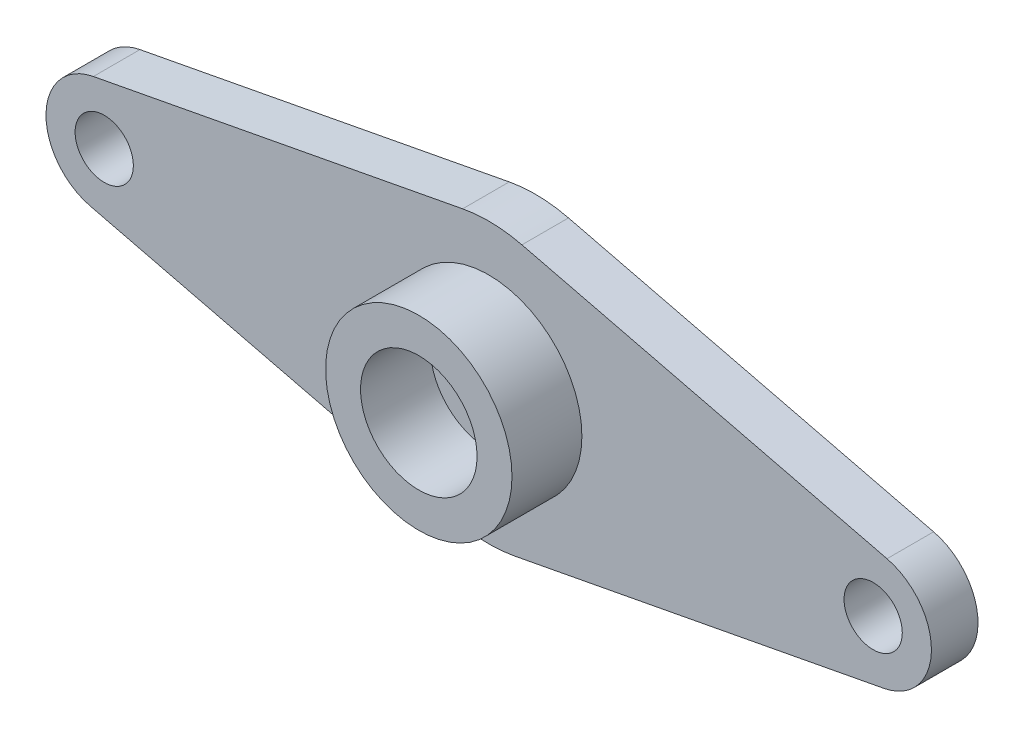
ISO-10303-21;
HEADER;
FILE_DESCRIPTION(('STEP AP214'),'2;1');
FILE_NAME('part.step','',(''),(''),'','','');
FILE_SCHEMA(('AUTOMOTIVE_DESIGN { 1 0 10303 214 1 1 1 1 }'));
ENDSEC;
DATA;
#1=APPLICATION_CONTEXT('core data for automotive mechanical design processes');
#2=APPLICATION_PROTOCOL_DEFINITION('international standard','automotive_design',2000,#1);
#3=PRODUCT_CONTEXT('',#1,'mechanical');
#4=PRODUCT('Part','Part','',(#3));
#5=PRODUCT_RELATED_PRODUCT_CATEGORY('part','',(#4));
#6=PRODUCT_DEFINITION_FORMATION('','',#4);
#7=PRODUCT_DEFINITION_CONTEXT('part definition',#1,'design');
#8=PRODUCT_DEFINITION('design','',#6,#7);
#9=PRODUCT_DEFINITION_SHAPE('','',#8);
#10=(LENGTH_UNIT() NAMED_UNIT(*) SI_UNIT(.MILLI.,.METRE.));
#11=(NAMED_UNIT(*) PLANE_ANGLE_UNIT() SI_UNIT($,.RADIAN.));
#12=(NAMED_UNIT(*) SI_UNIT($,.STERADIAN.) SOLID_ANGLE_UNIT());
#13=UNCERTAINTY_MEASURE_WITH_UNIT(LENGTH_MEASURE(1.E-05),#10,'distance_accuracy_value','');
#14=(GEOMETRIC_REPRESENTATION_CONTEXT(3) GLOBAL_UNCERTAINTY_ASSIGNED_CONTEXT((#13)) GLOBAL_UNIT_ASSIGNED_CONTEXT((#10,
#11,#12)) REPRESENTATION_CONTEXT('',''));
#15=CARTESIAN_POINT('',(0.,0.,0.));
#16=DIRECTION('',(0.,0.,1.));
#17=DIRECTION('',(1.,0.,0.));
#18=AXIS2_PLACEMENT_3D('',#15,#16,#17);
#19=CARTESIAN_POINT('',(-16.5,0.432588472456704,2.));
#20=DIRECTION('',(0.,0.,1.));
#21=DIRECTION('',(1.,0.,0.));
#22=AXIS2_PLACEMENT_3D('',#19,#20,#21);
#23=PLANE('',#22);
#24=CARTESIAN_POINT('',(0.,0.,2.));
#25=DIRECTION('',(0.,0.,1.));
#26=DIRECTION('',(1.,0.,0.));
#27=AXIS2_PLACEMENT_3D('',#24,#25,#26);
#28=CIRCLE('',#27,1.25);
#29=CARTESIAN_POINT('',(1.25,0.,2.));
#30=VERTEX_POINT('',#29);
#31=EDGE_CURVE('E228',#30,#30,#28,.T.);
#32=ORIENTED_EDGE('',*,*,#31,.F.);
#33=EDGE_LOOP('',(#32));
#34=FACE_BOUND('',#33,.T.);
#35=CARTESIAN_POINT('',(0.,0.,2.));
#36=DIRECTION('',(0.,0.,1.));
#37=DIRECTION('',(1.,0.,0.));
#38=AXIS2_PLACEMENT_3D('',#35,#36,#37);
#39=CIRCLE('',#38,2.5);
#40=CARTESIAN_POINT('',(2.5,0.,2.));
#41=VERTEX_POINT('',#40);
#42=EDGE_CURVE('E11',#41,#41,#39,.F.);
#43=ORIENTED_EDGE('',*,*,#42,.F.);
#44=EDGE_LOOP('',(#43));
#45=FACE_BOUND('',#44,.T.);
#46=ADVANCED_FACE('F39',(#34,#45),#23,.T.);
#47=CARTESIAN_POINT('',(0.,0.,2.));
#48=DIRECTION('',(0.,0.,1.));
#49=DIRECTION('',(1.,0.,0.));
#50=AXIS2_PLACEMENT_3D('',#47,#48,#49);
#51=CIRCLE('',#50,4.);
#52=CARTESIAN_POINT('',(4.,0.,2.));
#53=VERTEX_POINT('',#52);
#54=EDGE_CURVE('E240',#53,#53,#51,.T.);
#55=ORIENTED_EDGE('',*,*,#54,.F.);
#56=EDGE_LOOP('',(#55));
#57=FACE_BOUND('',#56,.T.);
#58=CARTESIAN_POINT('',(16.5,-0.432588472456706,2.));
#59=DIRECTION('',(0.,0.,1.));
#60=DIRECTION('',(1.,0.,0.));
#61=AXIS2_PLACEMENT_3D('',#58,#59,#60);
#62=CIRCLE('',#61,1.25);
#63=CARTESIAN_POINT('',(17.75,-0.432588472456706,2.));
#64=VERTEX_POINT('',#63);
#65=EDGE_CURVE('E220',#64,#64,#62,.T.);
#66=ORIENTED_EDGE('',*,*,#65,.F.);
#67=EDGE_LOOP('',(#66));
#68=FACE_BOUND('',#67,.T.);
#69=CARTESIAN_POINT('',(-16.5,0.432588472456704,2.));
#70=DIRECTION('',(0.,0.,1.));
#71=DIRECTION('',(1.,0.,0.));
#72=AXIS2_PLACEMENT_3D('',#69,#70,#71);
#73=CIRCLE('',#72,2.5);
#74=CARTESIAN_POINT('',(-16.9659075857741,2.88879085042115,2.));
#75=VERTEX_POINT('',#74);
#76=CARTESIAN_POINT('',(-17.0939699611912,-1.99582658374817,2.));
#77=VERTEX_POINT('',#76);
#78=EDGE_CURVE('E166',#75,#77,#73,.T.);
#79=ORIENTED_EDGE('',*,*,#78,.T.);
#80=DIRECTION('',(0.971366022481951,-0.237587984476473,0.));
#81=VECTOR('',#80,1.);
#82=CARTESIAN_POINT('',(-1.42552790685884,-5.82819613489171,2.));
#83=LINE('',#82,#81);
#84=CARTESIAN_POINT('',(-1.42552790685884,-5.82819613489171,2.));
#85=VERTEX_POINT('',#84);
#86=EDGE_CURVE('E101',#77,#85,#83,.T.);
#87=ORIENTED_EDGE('',*,*,#86,.T.);
#88=CARTESIAN_POINT('',(0.,0.,2.));
#89=DIRECTION('',(0.,0.,1.));
#90=DIRECTION('',(1.,0.,0.));
#91=AXIS2_PLACEMENT_3D('',#88,#89,#90);
#92=CIRCLE('',#91,6.);
#93=CARTESIAN_POINT('',(1.11817820585772,-5.89488570711467,2.));
#94=VERTEX_POINT('',#93);
#95=EDGE_CURVE('E206',#85,#94,#92,.T.);
#96=ORIENTED_EDGE('',*,*,#95,.T.);
#97=DIRECTION('',(0.982480951185778,0.18636303430962,0.));
#98=VECTOR('',#97,1.);
#99=CARTESIAN_POINT('',(16.9659075857741,-2.88879085042115,2.));
#100=LINE('',#99,#98);
#101=CARTESIAN_POINT('',(16.9659075857741,-2.88879085042115,2.));
#102=VERTEX_POINT('',#101);
#103=EDGE_CURVE('E204',#94,#102,#100,.T.);
#104=ORIENTED_EDGE('',*,*,#103,.T.);
#105=CARTESIAN_POINT('',(16.5,-0.432588472456706,2.));
#106=DIRECTION('',(0.,0.,1.));
#107=DIRECTION('',(1.,0.,0.));
#108=AXIS2_PLACEMENT_3D('',#105,#106,#107);
#109=CIRCLE('',#108,2.5);
#110=CARTESIAN_POINT('',(17.0939699611912,1.99582658374817,2.));
#111=VERTEX_POINT('',#110);
#112=EDGE_CURVE('E121',#102,#111,#109,.T.);
#113=ORIENTED_EDGE('',*,*,#112,.T.);
#114=DIRECTION('',(-0.971366022481951,0.237587984476474,0.));
#115=VECTOR('',#114,1.);
#116=CARTESIAN_POINT('',(1.42552790685884,5.82819613489171,2.));
#117=LINE('',#116,#115);
#118=CARTESIAN_POINT('',(1.42552790685884,5.82819613489171,2.));
#119=VERTEX_POINT('',#118);
#120=EDGE_CURVE('E114',#111,#119,#117,.T.);
#121=ORIENTED_EDGE('',*,*,#120,.T.);
#122=CARTESIAN_POINT('',(0.,0.,2.));
#123=DIRECTION('',(0.,0.,1.));
#124=DIRECTION('',(1.,0.,0.));
#125=AXIS2_PLACEMENT_3D('',#122,#123,#124);
#126=CIRCLE('',#125,6.);
#127=CARTESIAN_POINT('',(-1.11817820585772,5.89488570711467,2.));
#128=VERTEX_POINT('',#127);
#129=EDGE_CURVE('E119',#119,#128,#126,.T.);
#130=ORIENTED_EDGE('',*,*,#129,.T.);
#131=DIRECTION('',(-0.982480951185778,-0.18636303430962,0.));
#132=VECTOR('',#131,1.);
#133=CARTESIAN_POINT('',(-16.9659075857741,2.88879085042115,2.));
#134=LINE('',#133,#132);
#135=EDGE_CURVE('E57',#128,#75,#134,.T.);
#136=ORIENTED_EDGE('',*,*,#135,.T.);
#137=EDGE_LOOP('',(#79,#87,#96,#104,#113,#121,#130,#136));
#138=FACE_BOUND('',#137,.T.);
#139=CARTESIAN_POINT('',(-16.5,0.432588472456704,2.));
#140=DIRECTION('',(0.,0.,1.));
#141=DIRECTION('',(1.,0.,0.));
#142=AXIS2_PLACEMENT_3D('',#139,#140,#141);
#143=CIRCLE('',#142,1.25);
#144=CARTESIAN_POINT('',(-15.25,0.432588472456704,2.));
#145=VERTEX_POINT('',#144);
#146=EDGE_CURVE('E148',#145,#145,#143,.T.);
#147=ORIENTED_EDGE('',*,*,#146,.F.);
#148=EDGE_LOOP('',(#147));
#149=FACE_BOUND('',#148,.T.);
#150=ADVANCED_FACE('F116',(#57,#68,#138,#149),#23,.T.);
#151=CARTESIAN_POINT('',(-16.5,0.432588472456704,0.));
#152=DIRECTION('',(0.,0.,1.));
#153=DIRECTION('',(1.,0.,0.));
#154=AXIS2_PLACEMENT_3D('',#151,#152,#153);
#155=PLANE('',#154);
#156=CARTESIAN_POINT('',(-16.5,0.432588472456704,0.));
#157=DIRECTION('',(0.,0.,1.));
#158=DIRECTION('',(1.,0.,0.));
#159=AXIS2_PLACEMENT_3D('',#156,#157,#158);
#160=CIRCLE('',#159,2.5);
#161=CARTESIAN_POINT('',(-16.9659075857741,2.88879085042115,0.));
#162=VERTEX_POINT('',#161);
#163=CARTESIAN_POINT('',(-17.0939699611912,-1.99582658374817,0.));
#164=VERTEX_POINT('',#163);
#165=EDGE_CURVE('E143',#162,#164,#160,.T.);
#166=ORIENTED_EDGE('',*,*,#165,.F.);
#167=DIRECTION('',(-0.982480951185778,-0.18636303430962,0.));
#168=VECTOR('',#167,1.);
#169=CARTESIAN_POINT('',(-16.9659075857741,2.88879085042115,0.));
#170=LINE('',#169,#168);
#171=CARTESIAN_POINT('',(-1.11817820585772,5.89488570711467,0.));
#172=VERTEX_POINT('',#171);
#173=EDGE_CURVE('E92',#172,#162,#170,.T.);
#174=ORIENTED_EDGE('',*,*,#173,.F.);
#175=CARTESIAN_POINT('',(0.,0.,0.));
#176=DIRECTION('',(0.,0.,1.));
#177=DIRECTION('',(1.,0.,0.));
#178=AXIS2_PLACEMENT_3D('',#175,#176,#177);
#179=CIRCLE('',#178,6.);
#180=CARTESIAN_POINT('',(1.42552790685884,5.82819613489171,0.));
#181=VERTEX_POINT('',#180);
#182=EDGE_CURVE('E86',#181,#172,#179,.T.);
#183=ORIENTED_EDGE('',*,*,#182,.F.);
#184=DIRECTION('',(-0.971366022481951,0.237587984476474,0.));
#185=VECTOR('',#184,1.);
#186=CARTESIAN_POINT('',(1.42552790685884,5.82819613489171,0.));
#187=LINE('',#186,#185);
#188=CARTESIAN_POINT('',(17.0939699611912,1.99582658374817,0.));
#189=VERTEX_POINT('',#188);
#190=EDGE_CURVE('E130',#189,#181,#187,.T.);
#191=ORIENTED_EDGE('',*,*,#190,.F.);
#192=CARTESIAN_POINT('',(16.5,-0.432588472456706,0.));
#193=DIRECTION('',(0.,0.,1.));
#194=DIRECTION('',(1.,0.,0.));
#195=AXIS2_PLACEMENT_3D('',#192,#193,#194);
#196=CIRCLE('',#195,2.5);
#197=CARTESIAN_POINT('',(16.9659075857741,-2.88879085042115,0.));
#198=VERTEX_POINT('',#197);
#199=EDGE_CURVE('E157',#198,#189,#196,.T.);
#200=ORIENTED_EDGE('',*,*,#199,.F.);
#201=DIRECTION('',(0.982480951185778,0.18636303430962,0.));
#202=VECTOR('',#201,1.);
#203=CARTESIAN_POINT('',(16.9659075857741,-2.88879085042115,0.));
#204=LINE('',#203,#202);
#205=CARTESIAN_POINT('',(1.11817820585772,-5.89488570711467,0.));
#206=VERTEX_POINT('',#205);
#207=EDGE_CURVE('E154',#206,#198,#204,.T.);
#208=ORIENTED_EDGE('',*,*,#207,.F.);
#209=CARTESIAN_POINT('',(0.,0.,0.));
#210=DIRECTION('',(0.,0.,1.));
#211=DIRECTION('',(1.,0.,0.));
#212=AXIS2_PLACEMENT_3D('',#209,#210,#211);
#213=CIRCLE('',#212,6.);
#214=CARTESIAN_POINT('',(-1.42552790685884,-5.82819613489171,0.));
#215=VERTEX_POINT('',#214);
#216=EDGE_CURVE('E151',#215,#206,#213,.T.);
#217=ORIENTED_EDGE('',*,*,#216,.F.);
#218=DIRECTION('',(0.971366022481951,-0.237587984476473,0.));
#219=VECTOR('',#218,1.);
#220=CARTESIAN_POINT('',(-1.42552790685884,-5.82819613489171,0.));
#221=LINE('',#220,#219);
#222=EDGE_CURVE('E147',#164,#215,#221,.T.);
#223=ORIENTED_EDGE('',*,*,#222,.F.);
#224=EDGE_LOOP('',(#166,#174,#183,#191,#200,#208,#217,#223));
#225=FACE_BOUND('',#224,.T.);
#226=CARTESIAN_POINT('',(-16.5,0.432588472456704,0.));
#227=DIRECTION('',(0.,0.,1.));
#228=DIRECTION('',(1.,0.,0.));
#229=AXIS2_PLACEMENT_3D('',#226,#227,#228);
#230=CIRCLE('',#229,1.25);
#231=CARTESIAN_POINT('',(-15.25,0.432588472456704,0.));
#232=VERTEX_POINT('',#231);
#233=EDGE_CURVE('E216',#232,#232,#230,.T.);
#234=ORIENTED_EDGE('',*,*,#233,.T.);
#235=EDGE_LOOP('',(#234));
#236=FACE_BOUND('',#235,.T.);
#237=CARTESIAN_POINT('',(16.5,-0.432588472456706,0.));
#238=DIRECTION('',(0.,0.,1.));
#239=DIRECTION('',(1.,0.,0.));
#240=AXIS2_PLACEMENT_3D('',#237,#238,#239);
#241=CIRCLE('',#240,1.25);
#242=CARTESIAN_POINT('',(17.75,-0.432588472456706,0.));
#243=VERTEX_POINT('',#242);
#244=EDGE_CURVE('E224',#243,#243,#241,.T.);
#245=ORIENTED_EDGE('',*,*,#244,.T.);
#246=EDGE_LOOP('',(#245));
#247=FACE_BOUND('',#246,.T.);
#248=CARTESIAN_POINT('',(0.,0.,0.));
#249=DIRECTION('',(0.,0.,1.));
#250=DIRECTION('',(1.,0.,0.));
#251=AXIS2_PLACEMENT_3D('',#248,#249,#250);
#252=CIRCLE('',#251,1.25);
#253=CARTESIAN_POINT('',(1.25,0.,0.));
#254=VERTEX_POINT('',#253);
#255=EDGE_CURVE('E232',#254,#254,#252,.T.);
#256=ORIENTED_EDGE('',*,*,#255,.T.);
#257=EDGE_LOOP('',(#256));
#258=FACE_BOUND('',#257,.T.);
#259=ADVANCED_FACE('F191',(#225,#236,#247,#258),#155,.F.);
#260=CARTESIAN_POINT('',(-16.5,0.432588472456704,2.));
#261=DIRECTION('',(0.,0.,-1.));
#262=DIRECTION('',(-1.,0.,0.));
#263=AXIS2_PLACEMENT_3D('',#260,#261,#262);
#264=CYLINDRICAL_SURFACE('',#263,2.5);
#265=ORIENTED_EDGE('',*,*,#165,.T.);
#266=DIRECTION('',(0.,0.,-1.));
#267=VECTOR('',#266,1.);
#268=CARTESIAN_POINT('',(-17.0939699611912,-1.99582658374817,2.));
#269=LINE('',#268,#267);
#270=EDGE_CURVE('E49',#77,#164,#269,.T.);
#271=ORIENTED_EDGE('',*,*,#270,.F.);
#272=ORIENTED_EDGE('',*,*,#78,.F.);
#273=DIRECTION('',(0.,0.,-1.));
#274=VECTOR('',#273,1.);
#275=CARTESIAN_POINT('',(-16.9659075857741,2.88879085042115,2.));
#276=LINE('',#275,#274);
#277=EDGE_CURVE('E139',#75,#162,#276,.T.);
#278=ORIENTED_EDGE('',*,*,#277,.T.);
#279=EDGE_LOOP('',(#265,#271,#272,#278));
#280=FACE_BOUND('',#279,.T.);
#281=ADVANCED_FACE('F41',(#280),#264,.T.);
#282=CARTESIAN_POINT('',(-1.42552790685884,-5.82819613489171,2.));
#283=DIRECTION('',(0.237587984476473,0.971366022481951,0.));
#284=DIRECTION('',(-0.971366022481951,0.237587984476473,0.));
#285=AXIS2_PLACEMENT_3D('',#282,#283,#284);
#286=PLANE('',#285);
#287=ORIENTED_EDGE('',*,*,#222,.T.);
#288=DIRECTION('',(0.,0.,-1.));
#289=VECTOR('',#288,1.);
#290=CARTESIAN_POINT('',(-1.42552790685884,-5.82819613489171,2.));
#291=LINE('',#290,#289);
#292=EDGE_CURVE('E181',#85,#215,#291,.T.);
#293=ORIENTED_EDGE('',*,*,#292,.F.);
#294=ORIENTED_EDGE('',*,*,#86,.F.);
#295=ORIENTED_EDGE('',*,*,#270,.T.);
#296=EDGE_LOOP('',(#287,#293,#294,#295));
#297=FACE_BOUND('',#296,.T.);
#298=ADVANCED_FACE('F186',(#297),#286,.F.);
#299=CARTESIAN_POINT('',(0.,0.,2.));
#300=DIRECTION('',(0.,0.,-1.));
#301=DIRECTION('',(-1.,0.,0.));
#302=AXIS2_PLACEMENT_3D('',#299,#300,#301);
#303=CYLINDRICAL_SURFACE('',#302,6.);
#304=ORIENTED_EDGE('',*,*,#216,.T.);
#305=DIRECTION('',(0.,0.,-1.));
#306=VECTOR('',#305,1.);
#307=CARTESIAN_POINT('',(1.11817820585772,-5.89488570711467,2.));
#308=LINE('',#307,#306);
#309=EDGE_CURVE('E177',#94,#206,#308,.T.);
#310=ORIENTED_EDGE('',*,*,#309,.F.);
#311=ORIENTED_EDGE('',*,*,#95,.F.);
#312=ORIENTED_EDGE('',*,*,#292,.T.);
#313=EDGE_LOOP('',(#304,#310,#311,#312));
#314=FACE_BOUND('',#313,.T.);
#315=ADVANCED_FACE('F198',(#314),#303,.T.);
#316=CARTESIAN_POINT('',(16.9659075857741,-2.88879085042115,2.));
#317=DIRECTION('',(-0.18636303430962,0.982480951185778,0.));
#318=DIRECTION('',(-0.982480951185778,-0.18636303430962,0.));
#319=AXIS2_PLACEMENT_3D('',#316,#317,#318);
#320=PLANE('',#319);
#321=ORIENTED_EDGE('',*,*,#207,.T.);
#322=DIRECTION('',(0.,0.,-1.));
#323=VECTOR('',#322,1.);
#324=CARTESIAN_POINT('',(16.9659075857741,-2.88879085042115,2.));
#325=LINE('',#324,#323);
#326=EDGE_CURVE('E173',#102,#198,#325,.T.);
#327=ORIENTED_EDGE('',*,*,#326,.F.);
#328=ORIENTED_EDGE('',*,*,#103,.F.);
#329=ORIENTED_EDGE('',*,*,#309,.T.);
#330=EDGE_LOOP('',(#321,#327,#328,#329));
#331=FACE_BOUND('',#330,.T.);
#332=ADVANCED_FACE('F202',(#331),#320,.F.);
#333=CARTESIAN_POINT('',(16.5,-0.432588472456706,2.));
#334=DIRECTION('',(0.,0.,-1.));
#335=DIRECTION('',(-1.,0.,0.));
#336=AXIS2_PLACEMENT_3D('',#333,#334,#335);
#337=CYLINDRICAL_SURFACE('',#336,2.5);
#338=ORIENTED_EDGE('',*,*,#199,.T.);
#339=DIRECTION('',(0.,0.,-1.));
#340=VECTOR('',#339,1.);
#341=CARTESIAN_POINT('',(17.0939699611912,1.99582658374817,2.));
#342=LINE('',#341,#340);
#343=EDGE_CURVE('E132',#111,#189,#342,.T.);
#344=ORIENTED_EDGE('',*,*,#343,.F.);
#345=ORIENTED_EDGE('',*,*,#112,.F.);
#346=ORIENTED_EDGE('',*,*,#326,.T.);
#347=EDGE_LOOP('',(#338,#344,#345,#346));
#348=FACE_BOUND('',#347,.T.);
#349=ADVANCED_FACE('F293',(#348),#337,.T.);
#350=CARTESIAN_POINT('',(1.42552790685884,5.82819613489171,2.));
#351=DIRECTION('',(-0.237587984476474,-0.971366022481951,0.));
#352=DIRECTION('',(0.971366022481951,-0.237587984476474,0.));
#353=AXIS2_PLACEMENT_3D('',#350,#351,#352);
#354=PLANE('',#353);
#355=ORIENTED_EDGE('',*,*,#190,.T.);
#356=DIRECTION('',(0.,0.,-1.));
#357=VECTOR('',#356,1.);
#358=CARTESIAN_POINT('',(1.42552790685884,5.82819613489171,2.));
#359=LINE('',#358,#357);
#360=EDGE_CURVE('E127',#119,#181,#359,.T.);
#361=ORIENTED_EDGE('',*,*,#360,.F.);
#362=ORIENTED_EDGE('',*,*,#120,.F.);
#363=ORIENTED_EDGE('',*,*,#343,.T.);
#364=EDGE_LOOP('',(#355,#361,#362,#363));
#365=FACE_BOUND('',#364,.T.);
#366=ADVANCED_FACE('F128',(#365),#354,.F.);
#367=CARTESIAN_POINT('',(0.,0.,2.));
#368=DIRECTION('',(0.,0.,-1.));
#369=DIRECTION('',(-1.,0.,0.));
#370=AXIS2_PLACEMENT_3D('',#367,#368,#369);
#371=CYLINDRICAL_SURFACE('',#370,6.);
#372=ORIENTED_EDGE('',*,*,#182,.T.);
#373=DIRECTION('',(0.,0.,-1.));
#374=VECTOR('',#373,1.);
#375=CARTESIAN_POINT('',(-1.11817820585772,5.89488570711467,2.));
#376=LINE('',#375,#374);
#377=EDGE_CURVE('E133',#128,#172,#376,.T.);
#378=ORIENTED_EDGE('',*,*,#377,.F.);
#379=ORIENTED_EDGE('',*,*,#129,.F.);
#380=ORIENTED_EDGE('',*,*,#360,.T.);
#381=EDGE_LOOP('',(#372,#378,#379,#380));
#382=FACE_BOUND('',#381,.T.);
#383=ADVANCED_FACE('F135',(#382),#371,.T.);
#384=CARTESIAN_POINT('',(-16.9659075857741,2.88879085042115,2.));
#385=DIRECTION('',(0.18636303430962,-0.982480951185778,0.));
#386=DIRECTION('',(0.982480951185778,0.18636303430962,0.));
#387=AXIS2_PLACEMENT_3D('',#384,#385,#386);
#388=PLANE('',#387);
#389=ORIENTED_EDGE('',*,*,#173,.T.);
#390=ORIENTED_EDGE('',*,*,#277,.F.);
#391=ORIENTED_EDGE('',*,*,#135,.F.);
#392=ORIENTED_EDGE('',*,*,#377,.T.);
#393=EDGE_LOOP('',(#389,#390,#391,#392));
#394=FACE_BOUND('',#393,.T.);
#395=ADVANCED_FACE('F286',(#394),#388,.F.);
#396=CARTESIAN_POINT('',(-16.5,0.432588472456704,2.));
#397=DIRECTION('',(0.,0.,-1.));
#398=DIRECTION('',(-1.,0.,0.));
#399=AXIS2_PLACEMENT_3D('',#396,#397,#398);
#400=CYLINDRICAL_SURFACE('',#399,1.25);
#401=ORIENTED_EDGE('',*,*,#146,.T.);
#402=EDGE_LOOP('',(#401));
#403=FACE_BOUND('',#402,.T.);
#404=ORIENTED_EDGE('',*,*,#233,.F.);
#405=EDGE_LOOP('',(#404));
#406=FACE_BOUND('',#405,.T.);
#407=ADVANCED_FACE('F282',(#403,#406),#400,.F.);
#408=CARTESIAN_POINT('',(16.5,-0.432588472456706,2.));
#409=DIRECTION('',(0.,0.,-1.));
#410=DIRECTION('',(-1.,0.,0.));
#411=AXIS2_PLACEMENT_3D('',#408,#409,#410);
#412=CYLINDRICAL_SURFACE('',#411,1.25);
#413=ORIENTED_EDGE('',*,*,#65,.T.);
#414=EDGE_LOOP('',(#413));
#415=FACE_BOUND('',#414,.T.);
#416=ORIENTED_EDGE('',*,*,#244,.F.);
#417=EDGE_LOOP('',(#416));
#418=FACE_BOUND('',#417,.T.);
#419=ADVANCED_FACE('F267',(#415,#418),#412,.F.);
#420=CARTESIAN_POINT('',(0.,0.,2.));
#421=DIRECTION('',(0.,0.,-1.));
#422=DIRECTION('',(-1.,0.,0.));
#423=AXIS2_PLACEMENT_3D('',#420,#421,#422);
#424=CYLINDRICAL_SURFACE('',#423,1.25);
#425=ORIENTED_EDGE('',*,*,#31,.T.);
#426=EDGE_LOOP('',(#425));
#427=FACE_BOUND('',#426,.T.);
#428=ORIENTED_EDGE('',*,*,#255,.F.);
#429=EDGE_LOOP('',(#428));
#430=FACE_BOUND('',#429,.T.);
#431=ADVANCED_FACE('F258',(#427,#430),#424,.F.);
#432=CARTESIAN_POINT('',(0.,0.,5.));
#433=DIRECTION('',(0.,0.,1.));
#434=DIRECTION('',(1.,0.,0.));
#435=AXIS2_PLACEMENT_3D('',#432,#433,#434);
#436=PLANE('',#435);
#437=CARTESIAN_POINT('',(0.,0.,5.));
#438=DIRECTION('',(0.,0.,1.));
#439=DIRECTION('',(1.,0.,0.));
#440=AXIS2_PLACEMENT_3D('',#437,#438,#439);
#441=CIRCLE('',#440,4.);
#442=CARTESIAN_POINT('',(4.,0.,5.));
#443=VERTEX_POINT('',#442);
#444=EDGE_CURVE('E236',#443,#443,#441,.T.);
#445=ORIENTED_EDGE('',*,*,#444,.T.);
#446=EDGE_LOOP('',(#445));
#447=FACE_BOUND('',#446,.T.);
#448=CARTESIAN_POINT('',(0.,0.,5.));
#449=DIRECTION('',(0.,0.,1.));
#450=DIRECTION('',(1.,0.,0.));
#451=AXIS2_PLACEMENT_3D('',#448,#449,#450);
#452=CIRCLE('',#451,2.5);
#453=CARTESIAN_POINT('',(2.5,0.,5.));
#454=VERTEX_POINT('',#453);
#455=EDGE_CURVE('E244',#454,#454,#452,.T.);
#456=ORIENTED_EDGE('',*,*,#455,.F.);
#457=EDGE_LOOP('',(#456));
#458=FACE_BOUND('',#457,.T.);
#459=ADVANCED_FACE('F255',(#447,#458),#436,.T.);
#460=CARTESIAN_POINT('',(0.,0.,5.));
#461=DIRECTION('',(0.,0.,-1.));
#462=DIRECTION('',(-1.,0.,0.));
#463=AXIS2_PLACEMENT_3D('',#460,#461,#462);
#464=CYLINDRICAL_SURFACE('',#463,4.);
#465=ORIENTED_EDGE('',*,*,#444,.F.);
#466=EDGE_LOOP('',(#465));
#467=FACE_BOUND('',#466,.T.);
#468=ORIENTED_EDGE('',*,*,#54,.T.);
#469=EDGE_LOOP('',(#468));
#470=FACE_BOUND('',#469,.T.);
#471=ADVANCED_FACE('F257',(#467,#470),#464,.T.);
#472=CARTESIAN_POINT('',(0.,0.,5.));
#473=DIRECTION('',(0.,0.,-1.));
#474=DIRECTION('',(-1.,0.,0.));
#475=AXIS2_PLACEMENT_3D('',#472,#473,#474);
#476=CYLINDRICAL_SURFACE('',#475,2.5);
#477=ORIENTED_EDGE('',*,*,#455,.T.);
#478=EDGE_LOOP('',(#477));
#479=FACE_BOUND('',#478,.T.);
#480=ORIENTED_EDGE('',*,*,#42,.T.);
#481=EDGE_LOOP('',(#480));
#482=FACE_BOUND('',#481,.T.);
#483=ADVANCED_FACE('F252',(#479,#482),#476,.F.);
#484=CLOSED_SHELL('',(#46,#150,#259,#281,#298,#315,#332,#349,#366,#383,#395,#407,#419,#431,#459,
#471,#483));
#485=MANIFOLD_SOLID_BREP('B2',#484);
#486=ADVANCED_BREP_SHAPE_REPRESENTATION('',(#18,#485),#14);
#487=SHAPE_DEFINITION_REPRESENTATION(#9,#486);
ENDSEC;
END-ISO-10303-21;
